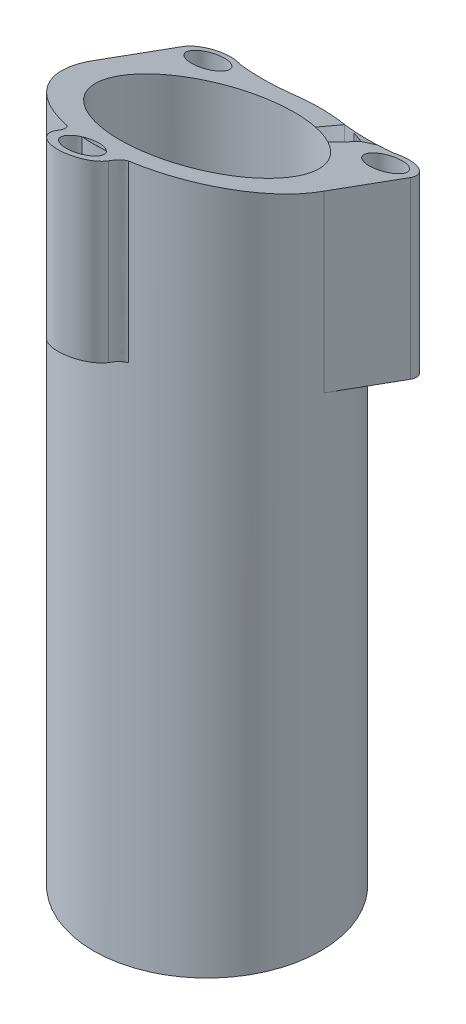
ISO-10303-21;
HEADER;
FILE_DESCRIPTION(('STEP AP214'),'2;1');
FILE_NAME('part.step','',(''),(''),'','','');
FILE_SCHEMA(('AUTOMOTIVE_DESIGN { 1 0 10303 214 1 1 1 1 }'));
ENDSEC;
DATA;
#1=APPLICATION_CONTEXT('core data for automotive mechanical design processes');
#2=APPLICATION_PROTOCOL_DEFINITION('international standard','automotive_design',2000,#1);
#3=PRODUCT_CONTEXT('',#1,'mechanical');
#4=PRODUCT('Part','Part','',(#3));
#5=PRODUCT_RELATED_PRODUCT_CATEGORY('part','',(#4));
#6=PRODUCT_DEFINITION_FORMATION('','',#4);
#7=PRODUCT_DEFINITION_CONTEXT('part definition',#1,'design');
#8=PRODUCT_DEFINITION('design','',#6,#7);
#9=PRODUCT_DEFINITION_SHAPE('','',#8);
#10=(LENGTH_UNIT() NAMED_UNIT(*) SI_UNIT(.MILLI.,.METRE.));
#11=(NAMED_UNIT(*) PLANE_ANGLE_UNIT() SI_UNIT($,.RADIAN.));
#12=(NAMED_UNIT(*) SI_UNIT($,.STERADIAN.) SOLID_ANGLE_UNIT());
#13=UNCERTAINTY_MEASURE_WITH_UNIT(LENGTH_MEASURE(1.E-05),#10,'distance_accuracy_value','');
#14=(GEOMETRIC_REPRESENTATION_CONTEXT(3) GLOBAL_UNCERTAINTY_ASSIGNED_CONTEXT((#13)) GLOBAL_UNIT_ASSIGNED_CONTEXT((#10,
#11,#12)) REPRESENTATION_CONTEXT('',''));
#15=CARTESIAN_POINT('',(0.,0.,0.));
#16=DIRECTION('',(0.,0.,1.));
#17=DIRECTION('',(1.,0.,0.));
#18=AXIS2_PLACEMENT_3D('',#15,#16,#17);
#19=CARTESIAN_POINT('',(0.,-40.,0.));
#20=DIRECTION('',(0.,1.,0.));
#21=DIRECTION('',(0.,0.,1.));
#22=AXIS2_PLACEMENT_3D('',#19,#20,#21);
#23=CYLINDRICAL_SURFACE('',#22,6.5);
#24=CARTESIAN_POINT('',(0.,-40.,0.));
#25=DIRECTION('',(0.,1.,0.));
#26=DIRECTION('',(0.,0.,1.));
#27=AXIS2_PLACEMENT_3D('',#24,#25,#26);
#28=CIRCLE('',#27,6.5);
#29=CARTESIAN_POINT('',(0.,-40.,6.5));
#30=VERTEX_POINT('',#29);
#31=EDGE_CURVE('E11',#30,#30,#28,.T.);
#32=ORIENTED_EDGE('',*,*,#31,.T.);
#33=EDGE_LOOP('',(#32));
#34=FACE_BOUND('',#33,.T.);
#35=CARTESIAN_POINT('',(0.,-12.3658065227303,0.));
#36=DIRECTION('',(0.,0.93969262078591,-0.342020143325666));
#37=DIRECTION('',(0.,0.342020143325666,0.93969262078591));
#38=AXIS2_PLACEMENT_3D('',#35,#36,#37);
#39=ELLIPSE('',#38,6.91715552109342,6.5);
#40=CARTESIAN_POINT('',(-4.96037224818147,-13.894685453274,-4.2005603387488));
#41=VERTEX_POINT('',#40);
#42=CARTESIAN_POINT('',(-6.4975,-12.4314158803476,-0.180260228558586));
#43=VERTEX_POINT('',#42);
#44=EDGE_CURVE('E311',#41,#43,#39,.T.);
#45=ORIENTED_EDGE('',*,*,#44,.F.);
#46=CARTESIAN_POINT('',(0.,-12.3658065227303,0.));
#47=DIRECTION('',(0.,0.93969262078591,-0.342020143325666));
#48=DIRECTION('',(0.,0.342020143325666,0.93969262078591));
#49=AXIS2_PLACEMENT_3D('',#46,#47,#48);
#50=ELLIPSE('',#49,6.91715552109342,6.5);
#51=CARTESIAN_POINT('',(-4.08862049074954,-14.2049615675026,-5.05303695638805));
#52=VERTEX_POINT('',#51);
#53=EDGE_CURVE('E231',#41,#52,#50,.F.);
#54=ORIENTED_EDGE('',*,*,#53,.T.);
#55=CARTESIAN_POINT('',(-3.08804748337541,-14.4475750839592,-5.71961211450705));
#56=VERTEX_POINT('',#55);
#57=EDGE_CURVE('E325',#56,#52,#39,.T.);
#58=ORIENTED_EDGE('',*,*,#57,.F.);
#59=DIRECTION('',(0.,1.,0.));
#60=VECTOR('',#59,1.);
#61=CARTESIAN_POINT('',(-3.08804748337541,-14.4475750839592,-5.71961211450705));
#62=LINE('',#61,#60);
#63=CARTESIAN_POINT('',(-3.08804748337541,-4.44757508395921,-5.71961211450705));
#64=VERTEX_POINT('',#63);
#65=EDGE_CURVE('E326',#56,#64,#62,.T.);
#66=ORIENTED_EDGE('',*,*,#65,.T.);
#67=CARTESIAN_POINT('',(0.,-2.36580652273029,0.));
#68=DIRECTION('',(0.,-0.93969262078591,0.342020143325666));
#69=DIRECTION('',(0.,0.342020143325666,0.93969262078591));
#70=AXIS2_PLACEMENT_3D('',#67,#68,#69);
#71=ELLIPSE('',#70,6.91715552109342,6.5);
#72=CARTESIAN_POINT('',(-2.32808527891433,-4.5746596493359,-6.06877408824052));
#73=VERTEX_POINT('',#72);
#74=EDGE_CURVE('E397',#73,#64,#71,.F.);
#75=ORIENTED_EDGE('',*,*,#74,.F.);
#76=DIRECTION('',(0.,1.,0.));
#77=VECTOR('',#76,1.);
#78=CARTESIAN_POINT('',(-2.32808527887807,-14.5746596493409,-6.06877408825442));
#79=LINE('',#78,#77);
#80=CARTESIAN_POINT('',(-2.32808527887807,-14.5746596493409,-6.06877408825442));
#81=VERTEX_POINT('',#80);
#82=EDGE_CURVE('E356',#81,#73,#79,.T.);
#83=ORIENTED_EDGE('',*,*,#82,.F.);
#84=CARTESIAN_POINT('',(0.,-12.3658065227303,0.));
#85=DIRECTION('',(0.,0.93969262078591,-0.342020143325666));
#86=DIRECTION('',(0.,0.342020143325666,0.93969262078591));
#87=AXIS2_PLACEMENT_3D('',#84,#85,#86);
#88=ELLIPSE('',#87,6.91715552109342,6.5);
#89=CARTESIAN_POINT('',(-1.5683771205031,-14.6617114081199,-6.30794682982366));
#90=VERTEX_POINT('',#89);
#91=EDGE_CURVE('E337',#90,#81,#88,.T.);
#92=ORIENTED_EDGE('',*,*,#91,.F.);
#93=DIRECTION('',(0.,1.,0.));
#94=VECTOR('',#93,1.);
#95=CARTESIAN_POINT('',(-1.5683771205031,-14.6617114081199,-6.30794682982366));
#96=LINE('',#95,#94);
#97=CARTESIAN_POINT('',(-1.5683771205031,-4.66171140811993,-6.30794682982366));
#98=VERTEX_POINT('',#97);
#99=EDGE_CURVE('E353',#90,#98,#96,.T.);
#100=ORIENTED_EDGE('',*,*,#99,.T.);
#101=CARTESIAN_POINT('',(1.56837711572616,-4.66171140844595,-6.30794683071938));
#102=VERTEX_POINT('',#101);
#103=EDGE_CURVE('E401',#102,#98,#71,.F.);
#104=ORIENTED_EDGE('',*,*,#103,.F.);
#105=DIRECTION('',(0.,1.,0.));
#106=VECTOR('',#105,1.);
#107=CARTESIAN_POINT('',(1.5683771205031,-14.6617114081199,-6.30794682982367));
#108=LINE('',#107,#106);
#109=CARTESIAN_POINT('',(1.5683771205031,-14.6617114081199,-6.30794682982367));
#110=VERTEX_POINT('',#109);
#111=EDGE_CURVE('E499',#110,#102,#108,.T.);
#112=ORIENTED_EDGE('',*,*,#111,.F.);
#113=CARTESIAN_POINT('',(0.,-12.3658065227303,0.));
#114=DIRECTION('',(0.,0.93969262078591,-0.342020143325666));
#115=DIRECTION('',(0.,0.342020143325666,0.93969262078591));
#116=AXIS2_PLACEMENT_3D('',#113,#114,#115);
#117=ELLIPSE('',#116,6.91715552109342,6.5);
#118=CARTESIAN_POINT('',(2.32808527887808,-14.5746596493409,-6.06877408825441));
#119=VERTEX_POINT('',#118);
#120=EDGE_CURVE('E623',#119,#110,#117,.T.);
#121=ORIENTED_EDGE('',*,*,#120,.F.);
#122=DIRECTION('',(0.,1.,0.));
#123=VECTOR('',#122,1.);
#124=CARTESIAN_POINT('',(2.32808527887808,-14.5746596493409,-6.06877408825441));
#125=LINE('',#124,#123);
#126=CARTESIAN_POINT('',(2.32808527887808,-4.57465964934088,-6.06877408825441));
#127=VERTEX_POINT('',#126);
#128=EDGE_CURVE('E496',#119,#127,#125,.T.);
#129=ORIENTED_EDGE('',*,*,#128,.T.);
#130=CARTESIAN_POINT('',(3.0880474833489,-4.4475750839645,-5.71961211452138));
#131=VERTEX_POINT('',#130);
#132=EDGE_CURVE('E394',#131,#127,#71,.F.);
#133=ORIENTED_EDGE('',*,*,#132,.F.);
#134=DIRECTION('',(0.,1.,0.));
#135=VECTOR('',#134,1.);
#136=CARTESIAN_POINT('',(3.0880474833754,-14.4475750839592,-5.71961211450706));
#137=LINE('',#136,#135);
#138=CARTESIAN_POINT('',(3.0880474833754,-14.4475750839592,-5.71961211450706));
#139=VERTEX_POINT('',#138);
#140=EDGE_CURVE('E494',#139,#131,#137,.T.);
#141=ORIENTED_EDGE('',*,*,#140,.F.);
#142=CARTESIAN_POINT('',(0.,-12.3658065227303,0.));
#143=DIRECTION('',(0.,0.93969262078591,-0.342020143325666));
#144=DIRECTION('',(0.,0.342020143325666,0.93969262078591));
#145=AXIS2_PLACEMENT_3D('',#142,#143,#144);
#146=ELLIPSE('',#145,6.91715552109342,6.5);
#147=CARTESIAN_POINT('',(4.08862049074956,-14.2049615675026,-5.05303695638804));
#148=VERTEX_POINT('',#147);
#149=EDGE_CURVE('E514',#148,#139,#146,.T.);
#150=ORIENTED_EDGE('',*,*,#149,.F.);
#151=CARTESIAN_POINT('',(0.,-12.3658065227303,0.));
#152=DIRECTION('',(0.,0.93969262078591,-0.342020143325666));
#153=DIRECTION('',(0.,0.342020143325666,0.93969262078591));
#154=AXIS2_PLACEMENT_3D('',#151,#152,#153);
#155=ELLIPSE('',#154,6.91715552109342,6.5);
#156=CARTESIAN_POINT('',(4.96037224818149,-13.8946854532741,-4.20056033874904));
#157=VERTEX_POINT('',#156);
#158=EDGE_CURVE('E284',#148,#157,#155,.F.);
#159=ORIENTED_EDGE('',*,*,#158,.T.);
#160=CARTESIAN_POINT('',(6.4975,-12.4314158803476,-0.180260228558586));
#161=VERTEX_POINT('',#160);
#162=EDGE_CURVE('E507',#161,#157,#146,.T.);
#163=ORIENTED_EDGE('',*,*,#162,.F.);
#164=DIRECTION('',(0.,1.,0.));
#165=VECTOR('',#164,1.);
#166=CARTESIAN_POINT('',(6.4975,-12.4314158803476,-0.180260228558586));
#167=LINE('',#166,#165);
#168=CARTESIAN_POINT('',(6.4975,-2.43141588034764,-0.180260228558586));
#169=VERTEX_POINT('',#168);
#170=EDGE_CURVE('E491',#161,#169,#167,.T.);
#171=ORIENTED_EDGE('',*,*,#170,.T.);
#172=CARTESIAN_POINT('',(1.75501972361136,-0.0878673051317265,6.25858656324225));
#173=VERTEX_POINT('',#172);
#174=EDGE_CURVE('E391',#173,#169,#71,.F.);
#175=ORIENTED_EDGE('',*,*,#174,.F.);
#176=DIRECTION('',(0.,1.,0.));
#177=VECTOR('',#176,1.);
#178=CARTESIAN_POINT('',(1.75501972358968,-10.0878673051255,6.25858656325941));
#179=LINE('',#178,#177);
#180=CARTESIAN_POINT('',(1.75501972358968,-10.0878673051255,6.25858656325941));
#181=VERTEX_POINT('',#180);
#182=EDGE_CURVE('E404',#181,#173,#179,.T.);
#183=ORIENTED_EDGE('',*,*,#182,.F.);
#184=CARTESIAN_POINT('',(0.,-12.3658065227303,0.));
#185=DIRECTION('',(0.,0.93969262078591,-0.342020143325666));
#186=DIRECTION('',(0.,0.342020143325666,0.93969262078591));
#187=AXIS2_PLACEMENT_3D('',#184,#185,#186);
#188=ELLIPSE('',#187,6.91715552109342,6.5);
#189=CARTESIAN_POINT('',(0.701745494266285,-10.0138277918496,6.46200845413227));
#190=VERTEX_POINT('',#189);
#191=EDGE_CURVE('E467',#190,#181,#188,.T.);
#192=ORIENTED_EDGE('',*,*,#191,.F.);
#193=DIRECTION('',(0.,1.,0.));
#194=VECTOR('',#193,1.);
#195=CARTESIAN_POINT('',(0.701745494266285,-10.0138277918496,6.46200845413227));
#196=LINE('',#195,#194);
#197=CARTESIAN_POINT('',(0.701745494266285,-0.0138277918496133,6.46200845413227));
#198=VERTEX_POINT('',#197);
#199=EDGE_CURVE('E408',#190,#198,#196,.T.);
#200=ORIENTED_EDGE('',*,*,#199,.T.);
#201=CARTESIAN_POINT('',(-0.701745494266283,-0.0138277918496132,6.46200845413227));
#202=VERTEX_POINT('',#201);
#203=EDGE_CURVE('E396',#202,#198,#71,.F.);
#204=ORIENTED_EDGE('',*,*,#203,.F.);
#205=DIRECTION('',(0.,1.,0.));
#206=VECTOR('',#205,1.);
#207=CARTESIAN_POINT('',(-0.701745494266283,-10.0138277918496,6.46200845413227));
#208=LINE('',#207,#206);
#209=CARTESIAN_POINT('',(-0.701745494266283,-10.0138277918496,6.46200845413227));
#210=VERTEX_POINT('',#209);
#211=EDGE_CURVE('E411',#210,#202,#208,.T.);
#212=ORIENTED_EDGE('',*,*,#211,.F.);
#213=CARTESIAN_POINT('',(-1.75501972358968,-10.0878673051255,6.25858656325941));
#214=VERTEX_POINT('',#213);
#215=EDGE_CURVE('E441',#214,#210,#188,.T.);
#216=ORIENTED_EDGE('',*,*,#215,.F.);
#217=DIRECTION('',(0.,1.,0.));
#218=VECTOR('',#217,1.);
#219=CARTESIAN_POINT('',(-1.75501972358968,-10.0878673051255,6.25858656325941));
#220=LINE('',#219,#218);
#221=CARTESIAN_POINT('',(-1.75501972358968,-0.0878673051254807,6.25858656325941));
#222=VERTEX_POINT('',#221);
#223=EDGE_CURVE('E414',#214,#222,#220,.T.);
#224=ORIENTED_EDGE('',*,*,#223,.T.);
#225=CARTESIAN_POINT('',(-6.4975,-2.43141588034764,-0.180260228558583));
#226=VERTEX_POINT('',#225);
#227=EDGE_CURVE('E400',#226,#222,#71,.F.);
#228=ORIENTED_EDGE('',*,*,#227,.F.);
#229=DIRECTION('',(0.,1.,0.));
#230=VECTOR('',#229,1.);
#231=CARTESIAN_POINT('',(-6.4975,-12.4314158803476,-0.180260228558586));
#232=LINE('',#231,#230);
#233=EDGE_CURVE('E317',#43,#226,#232,.T.);
#234=ORIENTED_EDGE('',*,*,#233,.F.);
#235=EDGE_LOOP('',(#45,#54,#58,#66,#75,#83,#92,#100,#104,#112,#121,#129,#133,#141,#150,#159,
#163,#171,#175,#183,#192,#200,#204,#212,#216,#224,#228,#234));
#236=FACE_BOUND('',#235,.T.);
#237=ADVANCED_FACE('F40',(#34,#236),#23,.T.);
#238=CARTESIAN_POINT('',(-6.5,0.,6.5));
#239=DIRECTION('',(0.,-0.93969262078591,0.342020143325666));
#240=DIRECTION('',(0.,-0.342020143325666,-0.93969262078591));
#241=AXIS2_PLACEMENT_3D('',#238,#239,#240);
#242=PLANE('',#241);
#243=CARTESIAN_POINT('',(-0.208497538331129,-2.29438972371368,0.196216042667867));
#244=DIRECTION('',(0.,0.93969262078591,-0.342020143325666));
#245=DIRECTION('',(0.,0.342020143325666,0.93969262078591));
#246=AXIS2_PLACEMENT_3D('',#243,#244,#245);
#247=CIRCLE('',#246,6.70923797517969);
#248=CARTESIAN_POINT('',(0.,-0.000803484512108127,6.4977924444461));
#249=VERTEX_POINT('',#248);
#250=CARTESIAN_POINT('',(0.68283017510881,-0.020035256572112,6.44495358497515));
#251=VERTEX_POINT('',#250);
#252=EDGE_CURVE('E210',#249,#251,#247,.T.);
#253=ORIENTED_EDGE('',*,*,#252,.F.);
#254=CARTESIAN_POINT('',(0.208497538331128,-2.29438972371368,0.196216042667868));
#255=DIRECTION('',(0.,0.93969262078591,-0.342020143325666));
#256=DIRECTION('',(0.,0.342020143325666,0.93969262078591));
#257=AXIS2_PLACEMENT_3D('',#254,#255,#256);
#258=CIRCLE('',#257,6.70923797517969);
#259=CARTESIAN_POINT('',(-0.682830175108809,-0.0200352565721116,6.44495358497515));
#260=VERTEX_POINT('',#259);
#261=EDGE_CURVE('E55',#260,#249,#258,.T.);
#262=ORIENTED_EDGE('',*,*,#261,.F.);
#263=CARTESIAN_POINT('',(0.,0.229836840266775,7.13147152879177));
#264=DIRECTION('',(0.,0.93969262078591,-0.342020143325666));
#265=DIRECTION('',(0.,0.342020143325666,0.93969262078591));
#266=AXIS2_PLACEMENT_3D('',#263,#264,#265);
#267=CIRCLE('',#266,1.);
#268=EDGE_CURVE('E201',#251,#260,#267,.T.);
#269=ORIENTED_EDGE('',*,*,#268,.F.);
#270=EDGE_LOOP('',(#253,#262,#269));
#271=FACE_BOUND('',#270,.T.);
#272=CARTESIAN_POINT('',(0.,-2.36580652273029,0.));
#273=DIRECTION('',(0.,-0.93969262078591,0.342020143325666));
#274=DIRECTION('',(0.,0.342020143325666,0.93969262078591));
#275=AXIS2_PLACEMENT_3D('',#272,#273,#274);
#276=ELLIPSE('',#275,5.32088886237955,5.);
#277=CARTESIAN_POINT('',(0.,-0.545955351399302,5.));
#278=VERTEX_POINT('',#277);
#279=EDGE_CURVE('E43',#278,#278,#276,.F.);
#280=ORIENTED_EDGE('',*,*,#279,.F.);
#281=EDGE_LOOP('',(#280));
#282=FACE_BOUND('',#281,.T.);
#283=ORIENTED_EDGE('',*,*,#74,.T.);
#284=CARTESIAN_POINT('',(0.,-2.61676021931636,-0.689489614698892));
#285=DIRECTION('',(0.,0.93969262078591,-0.342020143325666));
#286=DIRECTION('',(0.,0.342020143325666,0.93969262078591));
#287=AXIS2_PLACEMENT_3D('',#284,#285,#286);
#288=CIRCLE('',#287,6.17981008537088);
#289=EDGE_CURVE('E490',#64,#73,#288,.F.);
#290=ORIENTED_EDGE('',*,*,#289,.T.);
#291=EDGE_LOOP('',(#283,#290));
#292=FACE_BOUND('',#291,.T.);
#293=CARTESIAN_POINT('',(0.,0.229836840266775,7.13147152879177));
#294=DIRECTION('',(0.,0.93969262078591,-0.342020143325666));
#295=DIRECTION('',(0.,0.342020143325666,0.93969262078591));
#296=AXIS2_PLACEMENT_3D('',#293,#294,#295);
#297=CIRCLE('',#296,1.);
#298=EDGE_CURVE('E423',#202,#198,#297,.T.);
#299=ORIENTED_EDGE('',*,*,#298,.F.);
#300=ORIENTED_EDGE('',*,*,#203,.T.);
#301=EDGE_LOOP('',(#299,#300));
#302=FACE_BOUND('',#301,.T.);
#303=DIRECTION('',(0.,0.342020143325666,0.93969262078591));
#304=VECTOR('',#303,1.);
#305=CARTESIAN_POINT('',(-6.4975,-2.08905973148124,0.760355559863307));
#306=LINE('',#305,#304);
#307=CARTESIAN_POINT('',(-6.4975,-4.23403906034815,-5.13292671139553));
#308=VERTEX_POINT('',#307);
#309=EDGE_CURVE('E339',#308,#226,#306,.T.);
#310=ORIENTED_EDGE('',*,*,#309,.T.);
#311=ORIENTED_EDGE('',*,*,#227,.T.);
#312=CARTESIAN_POINT('',(-1.5,0.229836840266777,7.13147152879177));
#313=CARTESIAN_POINT('',(-1.44418798568542,-0.215169722947665,5.90882604485097));
#314=CARTESIAN_POINT('',(-2.50773942506667,-0.112183303058889,6.19177890800586));
#315=B_SPLINE_CURVE_WITH_KNOTS('',2,(#312,#313,#314),.UNSPECIFIED.,.F.,.F.,(3,3),(0.,1.),.UNSPECIFIED.);
#316=CARTESIAN_POINT('',(-1.5,0.229836840266775,7.13147152879177));
#317=VERTEX_POINT('',#316);
#318=EDGE_CURVE('E366',#317,#222,#315,.T.);
#319=ORIENTED_EDGE('',*,*,#318,.F.);
#320=CARTESIAN_POINT('',(0.,0.229836840266775,7.13147152879177));
#321=DIRECTION('',(0.,0.93969262078591,-0.342020143325666));
#322=DIRECTION('',(0.,0.342020143325666,0.93969262078591));
#323=AXIS2_PLACEMENT_3D('',#320,#321,#322);
#324=CIRCLE('',#323,1.5);
#325=CARTESIAN_POINT('',(1.5,0.229836840266775,7.13147152879177));
#326=VERTEX_POINT('',#325);
#327=EDGE_CURVE('E348',#317,#326,#324,.T.);
#328=ORIENTED_EDGE('',*,*,#327,.T.);
#329=CARTESIAN_POINT('',(1.5,0.229836840266777,7.13147152879177));
#330=CARTESIAN_POINT('',(1.44418798568541,-0.215169722947666,5.90882604485097));
#331=CARTESIAN_POINT('',(2.50773942506667,-0.112183303058889,6.19177890800586));
#332=B_SPLINE_CURVE_WITH_KNOTS('',2,(#329,#330,#331),.UNSPECIFIED.,.F.,.F.,(3,3),(0.,1.),.UNSPECIFIED.);
#333=EDGE_CURVE('E428',#326,#173,#332,.T.);
#334=ORIENTED_EDGE('',*,*,#333,.T.);
#335=ORIENTED_EDGE('',*,*,#174,.T.);
#336=DIRECTION('',(0.,0.342020143325666,0.93969262078591));
#337=VECTOR('',#336,1.);
#338=CARTESIAN_POINT('',(6.4975,-2.08905973148124,0.760355559863307));
#339=LINE('',#338,#337);
#340=CARTESIAN_POINT('',(6.4975,-4.23403906034815,-5.13292671139553));
#341=VERTEX_POINT('',#340);
#342=EDGE_CURVE('E480',#341,#169,#339,.T.);
#343=ORIENTED_EDGE('',*,*,#342,.F.);
#344=CARTESIAN_POINT('',(5.085,-4.23403906034815,-5.13292671139553));
#345=DIRECTION('',(0.,0.93969262078591,-0.342020143325666));
#346=DIRECTION('',(0.,0.342020143325666,0.93969262078591));
#347=AXIS2_PLACEMENT_3D('',#344,#345,#346);
#348=CIRCLE('',#347,1.4125);
#349=CARTESIAN_POINT('',(4.40955085002037,-4.65832668932283,-6.29864739135743));
#350=VERTEX_POINT('',#349);
#351=EDGE_CURVE('E229',#350,#341,#348,.F.);
#352=ORIENTED_EDGE('',*,*,#351,.F.);
#353=CARTESIAN_POINT('',(1.54182835744469,-4.6635391253547,-6.31296844165534));
#354=CARTESIAN_POINT('',(3.01133367562147,-4.56149656565935,-6.03260881306901));
#355=CARTESIAN_POINT('',(4.40955085002037,-4.65832668932283,-6.29864739135743));
#356=B_SPLINE_CURVE_WITH_KNOTS('',2,(#353,#354,#355),.UNSPECIFIED.,.F.,.F.,(3,3),(0.,
0.804475913715981),.UNSPECIFIED.);
#357=EDGE_CURVE('E63',#102,#350,#356,.T.);
#358=ORIENTED_EDGE('',*,*,#357,.F.);
#359=ORIENTED_EDGE('',*,*,#103,.T.);
#360=CARTESIAN_POINT('',(-1.54182835744469,-4.6635391253547,-6.31296844165534));
#361=CARTESIAN_POINT('',(-3.01133367562147,-4.56149656565935,-6.03260881306901));
#362=CARTESIAN_POINT('',(-4.40955085002037,-4.65832668932283,-6.29864739135743));
#363=B_SPLINE_CURVE_WITH_KNOTS('',2,(#360,#361,#362),.UNSPECIFIED.,.F.,.F.,(3,3),(0.,
0.804475913715981),.UNSPECIFIED.);
#364=CARTESIAN_POINT('',(-4.40955085002037,-4.65832668932283,-6.29864739135743));
#365=VERTEX_POINT('',#364);
#366=EDGE_CURVE('E569',#98,#365,#363,.T.);
#367=ORIENTED_EDGE('',*,*,#366,.T.);
#368=CARTESIAN_POINT('',(-5.085,-4.23403906034815,-5.13292671139553));
#369=DIRECTION('',(0.,0.93969262078591,-0.342020143325666));
#370=DIRECTION('',(0.,0.342020143325666,0.93969262078591));
#371=AXIS2_PLACEMENT_3D('',#368,#369,#370);
#372=CIRCLE('',#371,1.4125);
#373=EDGE_CURVE('E343',#365,#308,#372,.T.);
#374=ORIENTED_EDGE('',*,*,#373,.T.);
#375=EDGE_LOOP('',(#310,#311,#319,#328,#334,#335,#343,#352,#358,#359,#367,#374));
#376=FACE_BOUND('',#375,.T.);
#377=CARTESIAN_POINT('',(-5.085,-4.23403906034815,-5.13292671139553));
#378=DIRECTION('',(0.,0.93969262078591,-0.342020143325666));
#379=DIRECTION('',(0.,0.342020143325666,0.93969262078591));
#380=AXIS2_PLACEMENT_3D('',#377,#378,#379);
#381=CIRCLE('',#380,1.);
#382=CARTESIAN_POINT('',(-5.085,-3.89201891702248,-4.19323409060962));
#383=VERTEX_POINT('',#382);
#384=EDGE_CURVE('E334',#383,#383,#381,.T.);
#385=ORIENTED_EDGE('',*,*,#384,.F.);
#386=EDGE_LOOP('',(#385));
#387=FACE_BOUND('',#386,.T.);
#388=CARTESIAN_POINT('',(0.,-2.61676021931636,-0.689489614698892));
#389=DIRECTION('',(0.,0.93969262078591,-0.342020143325666));
#390=DIRECTION('',(0.,0.342020143325666,0.93969262078591));
#391=AXIS2_PLACEMENT_3D('',#388,#389,#390);
#392=CIRCLE('',#391,6.17981008537088);
#393=EDGE_CURVE('E474',#127,#131,#392,.F.);
#394=ORIENTED_EDGE('',*,*,#393,.T.);
#395=ORIENTED_EDGE('',*,*,#132,.T.);
#396=EDGE_LOOP('',(#394,#395));
#397=FACE_BOUND('',#396,.T.);
#398=CARTESIAN_POINT('',(5.085,-4.23403906034815,-5.13292671139553));
#399=DIRECTION('',(0.,0.93969262078591,-0.342020143325666));
#400=DIRECTION('',(0.,0.342020143325666,0.93969262078591));
#401=AXIS2_PLACEMENT_3D('',#398,#399,#400);
#402=CIRCLE('',#401,1.);
#403=CARTESIAN_POINT('',(5.085,-3.89201891702248,-4.19323409060962));
#404=VERTEX_POINT('',#403);
#405=EDGE_CURVE('E478',#404,#404,#402,.F.);
#406=ORIENTED_EDGE('',*,*,#405,.T.);
#407=EDGE_LOOP('',(#406));
#408=FACE_BOUND('',#407,.T.);
#409=ADVANCED_FACE('F214',(#271,#282,#292,#302,#376,#387,#397,#408),#242,.F.);
#410=CARTESIAN_POINT('',(0.,-40.,0.));
#411=DIRECTION('',(0.,1.,0.));
#412=DIRECTION('',(0.,0.,1.));
#413=AXIS2_PLACEMENT_3D('',#410,#411,#412);
#414=PLANE('',#413);
#415=CARTESIAN_POINT('',(0.,-40.,0.));
#416=DIRECTION('',(0.,1.,0.));
#417=DIRECTION('',(0.,0.,1.));
#418=AXIS2_PLACEMENT_3D('',#415,#416,#417);
#419=CIRCLE('',#418,5.);
#420=CARTESIAN_POINT('',(0.,-40.,5.));
#421=VERTEX_POINT('',#420);
#422=EDGE_CURVE('E48',#421,#421,#419,.T.);
#423=ORIENTED_EDGE('',*,*,#422,.T.);
#424=EDGE_LOOP('',(#423));
#425=FACE_BOUND('',#424,.T.);
#426=ORIENTED_EDGE('',*,*,#31,.F.);
#427=EDGE_LOOP('',(#426));
#428=FACE_BOUND('',#427,.T.);
#429=ADVANCED_FACE('F304',(#425,#428),#414,.F.);
#430=CARTESIAN_POINT('',(0.,-40.,0.));
#431=DIRECTION('',(0.,1.,0.));
#432=DIRECTION('',(0.,0.,1.));
#433=AXIS2_PLACEMENT_3D('',#430,#431,#432);
#434=CYLINDRICAL_SURFACE('',#433,5.);
#435=ORIENTED_EDGE('',*,*,#279,.T.);
#436=EDGE_LOOP('',(#435));
#437=FACE_BOUND('',#436,.T.);
#438=ORIENTED_EDGE('',*,*,#422,.F.);
#439=EDGE_LOOP('',(#438));
#440=FACE_BOUND('',#439,.T.);
#441=ADVANCED_FACE('F376',(#437,#440),#434,.F.);
#442=CARTESIAN_POINT('',(0.,-9.77016315973323,7.13147152879177));
#443=DIRECTION('',(0.,0.93969262078591,-0.342020143325666));
#444=DIRECTION('',(0.,0.342020143325666,0.93969262078591));
#445=AXIS2_PLACEMENT_3D('',#442,#443,#444);
#446=CIRCLE('',#445,1.5);
#447=DIRECTION('',(0.,1.,0.));
#448=VECTOR('',#447,1.);
#449=SURFACE_OF_LINEAR_EXTRUSION('',#446,#448);
#450=ORIENTED_EDGE('',*,*,#327,.F.);
#451=DIRECTION('',(0.,1.,0.));
#452=VECTOR('',#451,1.);
#453=CARTESIAN_POINT('',(-1.5,-9.77016315973323,7.13147152879177));
#454=LINE('',#453,#452);
#455=CARTESIAN_POINT('',(-1.5,-9.77016315973323,7.13147152879177));
#456=VERTEX_POINT('',#455);
#457=EDGE_CURVE('E417',#456,#317,#454,.T.);
#458=ORIENTED_EDGE('',*,*,#457,.F.);
#459=CARTESIAN_POINT('',(1.5,-9.77016315973323,7.13147152879177));
#460=VERTEX_POINT('',#459);
#461=EDGE_CURVE('E361',#456,#460,#446,.T.);
#462=ORIENTED_EDGE('',*,*,#461,.T.);
#463=DIRECTION('',(0.,1.,0.));
#464=VECTOR('',#463,1.);
#465=CARTESIAN_POINT('',(1.5,-9.77016315973323,7.13147152879177));
#466=LINE('',#465,#464);
#467=EDGE_CURVE('E402',#460,#326,#466,.T.);
#468=ORIENTED_EDGE('',*,*,#467,.T.);
#469=EDGE_LOOP('',(#450,#458,#462,#468));
#470=FACE_BOUND('',#469,.T.);
#471=ADVANCED_FACE('F372',(#470),#449,.T.);
#472=CARTESIAN_POINT('',(-1.5,-9.77016315973322,7.13147152879177));
#473=CARTESIAN_POINT('',(-1.44418798568542,-10.2151697229477,5.90882604485097));
#474=CARTESIAN_POINT('',(-2.50773942506667,-10.1121833030589,6.19177890800586));
#475=B_SPLINE_CURVE_WITH_KNOTS('',2,(#472,#473,#474),.UNSPECIFIED.,.F.,.F.,(3,3),(0.,1.),.UNSPECIFIED.);
#476=DIRECTION('',(0.,1.,0.));
#477=VECTOR('',#476,1.);
#478=SURFACE_OF_LINEAR_EXTRUSION('',#475,#477);
#479=ORIENTED_EDGE('',*,*,#318,.T.);
#480=ORIENTED_EDGE('',*,*,#223,.F.);
#481=EDGE_CURVE('E405',#456,#214,#475,.T.);
#482=ORIENTED_EDGE('',*,*,#481,.F.);
#483=ORIENTED_EDGE('',*,*,#457,.T.);
#484=EDGE_LOOP('',(#479,#480,#482,#483));
#485=FACE_BOUND('',#484,.T.);
#486=ADVANCED_FACE('F375',(#485),#478,.F.);
#487=CARTESIAN_POINT('',(0.,-9.77016315973323,7.13147152879177));
#488=DIRECTION('',(0.,0.93969262078591,-0.342020143325666));
#489=DIRECTION('',(0.,0.342020143325666,0.93969262078591));
#490=AXIS2_PLACEMENT_3D('',#487,#488,#489);
#491=CIRCLE('',#490,1.);
#492=DIRECTION('',(0.,1.,0.));
#493=VECTOR('',#492,1.);
#494=SURFACE_OF_LINEAR_EXTRUSION('',#491,#493);
#495=ORIENTED_EDGE('',*,*,#298,.T.);
#496=ORIENTED_EDGE('',*,*,#199,.F.);
#497=EDGE_CURVE('E442',#210,#190,#491,.T.);
#498=ORIENTED_EDGE('',*,*,#497,.F.);
#499=ORIENTED_EDGE('',*,*,#211,.T.);
#500=EDGE_LOOP('',(#495,#496,#498,#499));
#501=FACE_BOUND('',#500,.T.);
#502=ADVANCED_FACE('F450',(#501),#494,.F.);
#503=CARTESIAN_POINT('',(1.5,-9.77016315973322,7.13147152879177));
#504=CARTESIAN_POINT('',(1.44418798568541,-10.2151697229477,5.90882604485097));
#505=CARTESIAN_POINT('',(2.50773942506667,-10.1121833030589,6.19177890800586));
#506=B_SPLINE_CURVE_WITH_KNOTS('',2,(#503,#504,#505),.UNSPECIFIED.,.F.,.F.,(3,3),(0.,1.),.UNSPECIFIED.);
#507=DIRECTION('',(0.,1.,0.));
#508=VECTOR('',#507,1.);
#509=SURFACE_OF_LINEAR_EXTRUSION('',#506,#508);
#510=ORIENTED_EDGE('',*,*,#333,.F.);
#511=ORIENTED_EDGE('',*,*,#467,.F.);
#512=EDGE_CURVE('E365',#460,#181,#506,.T.);
#513=ORIENTED_EDGE('',*,*,#512,.T.);
#514=ORIENTED_EDGE('',*,*,#182,.T.);
#515=EDGE_LOOP('',(#510,#511,#513,#514));
#516=FACE_BOUND('',#515,.T.);
#517=ADVANCED_FACE('F378',(#516),#509,.T.);
#518=CARTESIAN_POINT('',(0.,-12.0890597314812,0.760355559863308));
#519=DIRECTION('',(0.,0.93969262078591,-0.342020143325666));
#520=DIRECTION('',(0.,0.342020143325666,0.93969262078591));
#521=AXIS2_PLACEMENT_3D('',#518,#519,#520);
#522=PLANE('',#521);
#523=ORIENTED_EDGE('',*,*,#461,.F.);
#524=ORIENTED_EDGE('',*,*,#481,.T.);
#525=ORIENTED_EDGE('',*,*,#215,.T.);
#526=ORIENTED_EDGE('',*,*,#497,.T.);
#527=ORIENTED_EDGE('',*,*,#191,.T.);
#528=ORIENTED_EDGE('',*,*,#512,.F.);
#529=EDGE_LOOP('',(#523,#524,#525,#526,#527,#528));
#530=FACE_BOUND('',#529,.T.);
#531=ADVANCED_FACE('F452',(#530),#522,.F.);
#532=CARTESIAN_POINT('',(-5.085,-14.2340390603481,-5.13292671139553));
#533=DIRECTION('',(0.,0.93969262078591,-0.342020143325666));
#534=DIRECTION('',(0.,0.342020143325666,0.93969262078591));
#535=AXIS2_PLACEMENT_3D('',#532,#533,#534);
#536=CIRCLE('',#535,1.);
#537=DIRECTION('',(0.,1.,0.));
#538=VECTOR('',#537,1.);
#539=SURFACE_OF_LINEAR_EXTRUSION('',#536,#538);
#540=ORIENTED_EDGE('',*,*,#384,.T.);
#541=EDGE_LOOP('',(#540));
#542=FACE_BOUND('',#541,.T.);
#543=CARTESIAN_POINT('',(-4.0886204907493,-14.2049615675026,-5.05303695638803));
#544=CARTESIAN_POINT('',(-4.09328809746922,-14.1860707316522,-5.00113481145438));
#545=CARTESIAN_POINT('',(-4.10263373430791,-14.1673209287334,-4.94962015131572));
#546=CARTESIAN_POINT('',(-4.1302298170119,-14.1306035012097,-4.848739848294));
#547=CARTESIAN_POINT('',(-4.1484802628772,-14.1126358766049,-4.79937420541092));
#548=CARTESIAN_POINT('',(-4.19343471242347,-14.0779829181598,-4.70416598456592));
#549=CARTESIAN_POINT('',(-4.22013871610445,-14.0612975843197,-4.658323406604));
#550=CARTESIAN_POINT('',(-4.28124875095609,-14.0296682803048,-4.57142260803008));
#551=CARTESIAN_POINT('',(-4.31565478212676,-14.0147243101301,-4.53036438741807));
#552=CARTESIAN_POINT('',(-4.39122777656373,-13.9869898925483,-4.45416470137049));
#553=CARTESIAN_POINT('',(-4.43239473983002,-13.9741994451413,-4.41902323593492));
#554=CARTESIAN_POINT('',(-4.52033767664197,-13.9511260458381,-4.35562959235943));
#555=CARTESIAN_POINT('',(-4.56711365018761,-13.940843093942,-4.32737741421952));
#556=CARTESIAN_POINT('',(-4.6686478752267,-13.9224089663422,-4.27673006489174));
#557=CARTESIAN_POINT('',(-4.72374027404785,-13.9144705090261,-4.25491933267034));
#558=CARTESIAN_POINT('',(-4.80970114808021,-13.9050658662503,-4.22908028900581));
#559=CARTESIAN_POINT('',(-4.83942837235231,-13.9023250734029,-4.22155002254611));
#560=CARTESIAN_POINT('',(-4.8994963531972,-13.8977907626599,-4.209092106167));
#561=CARTESIAN_POINT('',(-4.92983715240887,-13.895997310834,-4.20416463777247));
#562=CARTESIAN_POINT('',(-4.96037224818147,-13.894685453274,-4.2005603387488));
#563=B_SPLINE_CURVE_WITH_KNOTS('',3,(#543,#544,#545,#546,#547,#548,#549,#550,#551,#552,#553,
#554,#555,#556,#557,#558,#559,#560,#561,#562),.UNSPECIFIED.,.F.,.F.,(4,2,2,2,2,2,2,2,2,4),(0.,
0.166076362379822,0.332152724759643,0.498229087139464,0.664305449519285,0.830381811899107,
0.996458174278928,1.17476310127632,1.26701471572629,1.35927276315789),.UNSPECIFIED.);
#564=EDGE_CURVE('E270',#52,#41,#563,.T.);
#565=ORIENTED_EDGE('',*,*,#564,.T.);
#566=EDGE_CURVE('E322',#52,#41,#536,.T.);
#567=ORIENTED_EDGE('',*,*,#566,.F.);
#568=EDGE_LOOP('',(#565,#567));
#569=FACE_BOUND('',#568,.T.);
#570=ADVANCED_FACE('F548',(#542,#569),#539,.F.);
#571=CARTESIAN_POINT('',(-6.4975,-12.0890597314812,0.760355559863307));
#572=DIRECTION('',(-1.,0.,0.));
#573=DIRECTION('',(0.,0.,1.));
#574=AXIS2_PLACEMENT_3D('',#571,#572,#573);
#575=PLANE('',#574);
#576=ORIENTED_EDGE('',*,*,#309,.F.);
#577=DIRECTION('',(0.,1.,0.));
#578=VECTOR('',#577,1.);
#579=CARTESIAN_POINT('',(-6.4975,-14.2340390603481,-5.13292671139553));
#580=LINE('',#579,#578);
#581=CARTESIAN_POINT('',(-6.4975,-14.2340390603481,-5.13292671139553));
#582=VERTEX_POINT('',#581);
#583=EDGE_CURVE('E349',#582,#308,#580,.T.);
#584=ORIENTED_EDGE('',*,*,#583,.F.);
#585=DIRECTION('',(0.,0.342020143325666,0.93969262078591));
#586=VECTOR('',#585,1.);
#587=CARTESIAN_POINT('',(-6.4975,-12.0890597314812,0.760355559863307));
#588=LINE('',#587,#586);
#589=EDGE_CURVE('E323',#582,#43,#588,.T.);
#590=ORIENTED_EDGE('',*,*,#589,.T.);
#591=ORIENTED_EDGE('',*,*,#233,.T.);
#592=EDGE_LOOP('',(#576,#584,#590,#591));
#593=FACE_BOUND('',#592,.T.);
#594=ADVANCED_FACE('F552',(#593),#575,.T.);
#595=CARTESIAN_POINT('',(-5.085,-14.2340390603481,-5.13292671139553));
#596=DIRECTION('',(0.,0.93969262078591,-0.342020143325666));
#597=DIRECTION('',(0.,0.342020143325666,0.93969262078591));
#598=AXIS2_PLACEMENT_3D('',#595,#596,#597);
#599=CIRCLE('',#598,1.4125);
#600=DIRECTION('',(0.,1.,0.));
#601=VECTOR('',#600,1.);
#602=SURFACE_OF_LINEAR_EXTRUSION('',#599,#601);
#603=ORIENTED_EDGE('',*,*,#373,.F.);
#604=DIRECTION('',(0.,1.,0.));
#605=VECTOR('',#604,1.);
#606=CARTESIAN_POINT('',(-4.40955085002037,-14.6583266893228,-6.29864739135743));
#607=LINE('',#606,#605);
#608=CARTESIAN_POINT('',(-4.40955085002037,-14.6583266893228,-6.29864739135743));
#609=VERTEX_POINT('',#608);
#610=EDGE_CURVE('E351',#609,#365,#607,.T.);
#611=ORIENTED_EDGE('',*,*,#610,.F.);
#612=EDGE_CURVE('E328',#609,#582,#599,.T.);
#613=ORIENTED_EDGE('',*,*,#612,.T.);
#614=ORIENTED_EDGE('',*,*,#583,.T.);
#615=EDGE_LOOP('',(#603,#611,#613,#614));
#616=FACE_BOUND('',#615,.T.);
#617=ADVANCED_FACE('F557',(#616),#602,.T.);
#618=CARTESIAN_POINT('',(-1.54182835744469,-14.6635391253547,-6.31296844165534));
#619=CARTESIAN_POINT('',(-3.01133367562147,-14.5614965656593,-6.03260881306901));
#620=CARTESIAN_POINT('',(-4.40955085002037,-14.6583266893228,-6.29864739135743));
#621=B_SPLINE_CURVE_WITH_KNOTS('',2,(#618,#619,#620),.UNSPECIFIED.,.F.,.F.,(3,3),(0.,
0.804475913715981),.UNSPECIFIED.);
#622=DIRECTION('',(0.,1.,0.));
#623=VECTOR('',#622,1.);
#624=SURFACE_OF_LINEAR_EXTRUSION('',#621,#623);
#625=ORIENTED_EDGE('',*,*,#366,.F.);
#626=ORIENTED_EDGE('',*,*,#99,.F.);
#627=EDGE_CURVE('E581',#90,#609,#621,.T.);
#628=ORIENTED_EDGE('',*,*,#627,.T.);
#629=ORIENTED_EDGE('',*,*,#610,.T.);
#630=EDGE_LOOP('',(#625,#626,#628,#629));
#631=FACE_BOUND('',#630,.T.);
#632=ADVANCED_FACE('F583',(#631),#624,.T.);
#633=CARTESIAN_POINT('',(0.,-12.6167602193164,-0.689489614698892));
#634=DIRECTION('',(0.,0.93969262078591,-0.342020143325666));
#635=DIRECTION('',(0.,0.342020143325666,0.93969262078591));
#636=AXIS2_PLACEMENT_3D('',#633,#634,#635);
#637=CIRCLE('',#636,6.17981008537088);
#638=DIRECTION('',(0.,1.,0.));
#639=VECTOR('',#638,1.);
#640=SURFACE_OF_LINEAR_EXTRUSION('',#637,#639);
#641=ORIENTED_EDGE('',*,*,#289,.F.);
#642=ORIENTED_EDGE('',*,*,#65,.F.);
#643=EDGE_CURVE('E333',#56,#81,#637,.F.);
#644=ORIENTED_EDGE('',*,*,#643,.T.);
#645=ORIENTED_EDGE('',*,*,#82,.T.);
#646=EDGE_LOOP('',(#641,#642,#644,#645));
#647=FACE_BOUND('',#646,.T.);
#648=ADVANCED_FACE('F595',(#647),#640,.F.);
#649=CARTESIAN_POINT('',(0.,-12.0890597314812,0.760355559863308));
#650=DIRECTION('',(0.,0.93969262078591,-0.342020143325666));
#651=DIRECTION('',(0.,0.342020143325666,0.93969262078591));
#652=AXIS2_PLACEMENT_3D('',#649,#650,#651);
#653=PLANE('',#652);
#654=ORIENTED_EDGE('',*,*,#57,.T.);
#655=ORIENTED_EDGE('',*,*,#566,.T.);
#656=ORIENTED_EDGE('',*,*,#44,.T.);
#657=ORIENTED_EDGE('',*,*,#589,.F.);
#658=ORIENTED_EDGE('',*,*,#612,.F.);
#659=ORIENTED_EDGE('',*,*,#627,.F.);
#660=ORIENTED_EDGE('',*,*,#91,.T.);
#661=ORIENTED_EDGE('',*,*,#643,.F.);
#662=EDGE_LOOP('',(#654,#655,#656,#657,#658,#659,#660,#661));
#663=FACE_BOUND('',#662,.T.);
#664=ADVANCED_FACE('F562',(#663),#653,.F.);
#665=CARTESIAN_POINT('',(5.085,-14.2340390603481,-5.13292671139553));
#666=DIRECTION('',(0.,0.93969262078591,-0.342020143325666));
#667=DIRECTION('',(0.,0.342020143325666,0.93969262078591));
#668=AXIS2_PLACEMENT_3D('',#665,#666,#667);
#669=CIRCLE('',#668,1.4125);
#670=DIRECTION('',(0.,1.,0.));
#671=VECTOR('',#670,1.);
#672=SURFACE_OF_LINEAR_EXTRUSION('',#669,#671);
#673=ORIENTED_EDGE('',*,*,#351,.T.);
#674=DIRECTION('',(0.,1.,0.));
#675=VECTOR('',#674,1.);
#676=CARTESIAN_POINT('',(6.4975,-14.2340390603481,-5.13292671139553));
#677=LINE('',#676,#675);
#678=CARTESIAN_POINT('',(6.4975,-14.2340390603481,-5.13292671139553));
#679=VERTEX_POINT('',#678);
#680=EDGE_CURVE('E487',#679,#341,#677,.T.);
#681=ORIENTED_EDGE('',*,*,#680,.F.);
#682=CARTESIAN_POINT('',(4.40955085002037,-14.6583266893228,-6.29864739135743));
#683=VERTEX_POINT('',#682);
#684=EDGE_CURVE('E482',#683,#679,#669,.F.);
#685=ORIENTED_EDGE('',*,*,#684,.F.);
#686=DIRECTION('',(0.,1.,0.));
#687=VECTOR('',#686,1.);
#688=CARTESIAN_POINT('',(4.40955085002037,-14.6583266893228,-6.29864739135743));
#689=LINE('',#688,#687);
#690=EDGE_CURVE('E500',#683,#350,#689,.T.);
#691=ORIENTED_EDGE('',*,*,#690,.T.);
#692=EDGE_LOOP('',(#673,#681,#685,#691));
#693=FACE_BOUND('',#692,.T.);
#694=ADVANCED_FACE('F602',(#693),#672,.T.);
#695=CARTESIAN_POINT('',(6.4975,-12.0890597314812,0.760355559863307));
#696=DIRECTION('',(-1.,0.,0.));
#697=DIRECTION('',(0.,0.,1.));
#698=AXIS2_PLACEMENT_3D('',#695,#696,#697);
#699=PLANE('',#698);
#700=ORIENTED_EDGE('',*,*,#342,.T.);
#701=ORIENTED_EDGE('',*,*,#170,.F.);
#702=DIRECTION('',(0.,0.342020143325666,0.93969262078591));
#703=VECTOR('',#702,1.);
#704=CARTESIAN_POINT('',(6.4975,-12.0890597314812,0.760355559863307));
#705=LINE('',#704,#703);
#706=EDGE_CURVE('E502',#679,#161,#705,.T.);
#707=ORIENTED_EDGE('',*,*,#706,.F.);
#708=ORIENTED_EDGE('',*,*,#680,.T.);
#709=EDGE_LOOP('',(#700,#701,#707,#708));
#710=FACE_BOUND('',#709,.T.);
#711=ADVANCED_FACE('F607',(#710),#699,.F.);
#712=CARTESIAN_POINT('',(5.085,-14.2340390603481,-5.13292671139553));
#713=DIRECTION('',(0.,0.93969262078591,-0.342020143325666));
#714=DIRECTION('',(0.,0.342020143325666,0.93969262078591));
#715=AXIS2_PLACEMENT_3D('',#712,#713,#714);
#716=CIRCLE('',#715,1.);
#717=DIRECTION('',(0.,1.,0.));
#718=VECTOR('',#717,1.);
#719=SURFACE_OF_LINEAR_EXTRUSION('',#716,#718);
#720=ORIENTED_EDGE('',*,*,#405,.F.);
#721=EDGE_LOOP('',(#720));
#722=FACE_BOUND('',#721,.T.);
#723=CARTESIAN_POINT('',(4.0886204907493,-14.2049615675026,-5.05303695638802));
#724=CARTESIAN_POINT('',(4.09328809746923,-14.1860707316522,-5.00113481145436));
#725=CARTESIAN_POINT('',(4.10263373430792,-14.1673209287334,-4.94962015131571));
#726=CARTESIAN_POINT('',(4.13022981701191,-14.1306035012097,-4.84873984829398));
#727=CARTESIAN_POINT('',(4.14848026287721,-14.1126358766048,-4.7993742054109));
#728=CARTESIAN_POINT('',(4.19343471242348,-14.0779829181598,-4.70416598456591));
#729=CARTESIAN_POINT('',(4.22013871610446,-14.0612975843197,-4.65832340660399));
#730=CARTESIAN_POINT('',(4.2812487509561,-14.0296682803048,-4.57142260803006));
#731=CARTESIAN_POINT('',(4.31565478212677,-14.0147243101301,-4.53036438741806));
#732=CARTESIAN_POINT('',(4.39122777656374,-13.9869898925483,-4.45416470137048));
#733=CARTESIAN_POINT('',(4.43239473983004,-13.9741994451413,-4.41902323593491));
#734=CARTESIAN_POINT('',(4.52033767664198,-13.9511260458381,-4.35562959235942));
#735=CARTESIAN_POINT('',(4.56711365018762,-13.940843093942,-4.32737741421951));
#736=CARTESIAN_POINT('',(4.66864787522671,-13.9224089663422,-4.27673006489173));
#737=CARTESIAN_POINT('',(4.72374027404786,-13.9144705090261,-4.25491933267034));
#738=CARTESIAN_POINT('',(4.80970114808021,-13.9050658662503,-4.22908028900581));
#739=CARTESIAN_POINT('',(4.83942837235231,-13.9023250734029,-4.22155002254611));
#740=CARTESIAN_POINT('',(4.89949635319719,-13.8977907626599,-4.209092106167));
#741=CARTESIAN_POINT('',(4.92983715240886,-13.895997310834,-4.20416463777247));
#742=CARTESIAN_POINT('',(4.96037224818146,-13.894685453274,-4.2005603387488));
#743=B_SPLINE_CURVE_WITH_KNOTS('',3,(#723,#724,#725,#726,#727,#728,#729,#730,#731,#732,#733,
#734,#735,#736,#737,#738,#739,#740,#741,#742),.UNSPECIFIED.,.F.,.F.,(4,2,2,2,2,2,2,2,2,4),(0.,
0.166076362379821,0.332152724759644,0.498229087139467,0.664305449519287,0.830381811899108,
0.996458174278929,1.17476310127631,1.26701471572627,1.35927276315786),.UNSPECIFIED.);
#744=EDGE_CURVE('E277',#148,#157,#743,.T.);
#745=ORIENTED_EDGE('',*,*,#744,.F.);
#746=EDGE_CURVE('E512',#148,#157,#716,.F.);
#747=ORIENTED_EDGE('',*,*,#746,.T.);
#748=EDGE_LOOP('',(#745,#747));
#749=FACE_BOUND('',#748,.T.);
#750=ADVANCED_FACE('F611',(#722,#749),#719,.F.);
#751=CARTESIAN_POINT('',(0.,-12.6167602193164,-0.689489614698892));
#752=DIRECTION('',(0.,0.93969262078591,-0.342020143325666));
#753=DIRECTION('',(0.,0.342020143325666,0.93969262078591));
#754=AXIS2_PLACEMENT_3D('',#751,#752,#753);
#755=CIRCLE('',#754,6.17981008537088);
#756=DIRECTION('',(0.,1.,0.));
#757=VECTOR('',#756,1.);
#758=SURFACE_OF_LINEAR_EXTRUSION('',#755,#757);
#759=ORIENTED_EDGE('',*,*,#393,.F.);
#760=ORIENTED_EDGE('',*,*,#128,.F.);
#761=EDGE_CURVE('E628',#119,#139,#755,.F.);
#762=ORIENTED_EDGE('',*,*,#761,.T.);
#763=ORIENTED_EDGE('',*,*,#140,.T.);
#764=EDGE_LOOP('',(#759,#760,#762,#763));
#765=FACE_BOUND('',#764,.T.);
#766=ADVANCED_FACE('F631',(#765),#758,.F.);
#767=CARTESIAN_POINT('',(1.54182835744469,-14.6635391253547,-6.31296844165534));
#768=CARTESIAN_POINT('',(3.01133367562147,-14.5614965656593,-6.03260881306901));
#769=CARTESIAN_POINT('',(4.40955085002037,-14.6583266893228,-6.29864739135743));
#770=B_SPLINE_CURVE_WITH_KNOTS('',2,(#767,#768,#769),.UNSPECIFIED.,.F.,.F.,(3,3),(0.,
0.804475913715981),.UNSPECIFIED.);
#771=DIRECTION('',(0.,1.,0.));
#772=VECTOR('',#771,1.);
#773=SURFACE_OF_LINEAR_EXTRUSION('',#770,#772);
#774=ORIENTED_EDGE('',*,*,#357,.T.);
#775=ORIENTED_EDGE('',*,*,#690,.F.);
#776=EDGE_CURVE('E527',#110,#683,#770,.T.);
#777=ORIENTED_EDGE('',*,*,#776,.F.);
#778=ORIENTED_EDGE('',*,*,#111,.T.);
#779=EDGE_LOOP('',(#774,#775,#777,#778));
#780=FACE_BOUND('',#779,.T.);
#781=ADVANCED_FACE('F296',(#780),#773,.F.);
#782=CARTESIAN_POINT('',(0.,-12.0890597314812,0.760355559863308));
#783=DIRECTION('',(0.,0.93969262078591,-0.342020143325666));
#784=DIRECTION('',(0.,0.342020143325666,0.93969262078591));
#785=AXIS2_PLACEMENT_3D('',#782,#783,#784);
#786=PLANE('',#785);
#787=ORIENTED_EDGE('',*,*,#684,.T.);
#788=ORIENTED_EDGE('',*,*,#706,.T.);
#789=ORIENTED_EDGE('',*,*,#162,.T.);
#790=ORIENTED_EDGE('',*,*,#746,.F.);
#791=ORIENTED_EDGE('',*,*,#149,.T.);
#792=ORIENTED_EDGE('',*,*,#761,.F.);
#793=ORIENTED_EDGE('',*,*,#120,.T.);
#794=ORIENTED_EDGE('',*,*,#776,.T.);
#795=EDGE_LOOP('',(#787,#788,#789,#790,#791,#792,#793,#794));
#796=FACE_BOUND('',#795,.T.);
#797=ADVANCED_FACE('F291',(#796),#786,.F.);
#798=CARTESIAN_POINT('',(0.,-12.0890597314812,0.760355559863308));
#799=DIRECTION('',(0.,0.93969262078591,-0.342020143325666));
#800=DIRECTION('',(0.,0.342020143325666,0.93969262078591));
#801=AXIS2_PLACEMENT_3D('',#798,#799,#800);
#802=PLANE('',#801);
#803=ORIENTED_EDGE('',*,*,#158,.F.);
#804=ORIENTED_EDGE('',*,*,#744,.T.);
#805=EDGE_LOOP('',(#803,#804));
#806=FACE_BOUND('',#805,.T.);
#807=ADVANCED_FACE('F265',(#806),#802,.T.);
#808=CARTESIAN_POINT('',(0.,-12.0890597314812,0.760355559863308));
#809=DIRECTION('',(0.,0.93969262078591,-0.342020143325666));
#810=DIRECTION('',(0.,0.342020143325666,0.93969262078591));
#811=AXIS2_PLACEMENT_3D('',#808,#809,#810);
#812=PLANE('',#811);
#813=ORIENTED_EDGE('',*,*,#53,.F.);
#814=ORIENTED_EDGE('',*,*,#564,.F.);
#815=EDGE_LOOP('',(#813,#814));
#816=FACE_BOUND('',#815,.T.);
#817=ADVANCED_FACE('F261',(#816),#812,.T.);
#818=CARTESIAN_POINT('',(0.208497538331128,-13.7433917749611,0.196216042667868));
#819=DIRECTION('',(0.,0.93969262078591,-0.342020143325666));
#820=DIRECTION('',(0.,0.342020143325666,0.93969262078591));
#821=AXIS2_PLACEMENT_3D('',#818,#819,#820);
#822=CIRCLE('',#821,6.70923797517969);
#823=DIRECTION('',(0.,1.,0.));
#824=VECTOR('',#823,1.);
#825=SURFACE_OF_LINEAR_EXTRUSION('',#822,#824);
#826=CARTESIAN_POINT('',(0.,-10.0008034845121,6.4977924444461));
#827=CARTESIAN_POINT('',(-0.114283854169503,-10.0020200601608,6.49444993032216));
#828=CARTESIAN_POINT('',(-0.228328295846654,-10.0042309956569,6.48837543497095));
#829=CARTESIAN_POINT('',(-0.455938354216258,-10.0106415863435,6.47076248181396));
#830=CARTESIAN_POINT('',(-0.569503970908711,-10.0148412415342,6.45922402400819));
#831=CARTESIAN_POINT('',(-0.682830175108813,-10.0200352565721,6.44495358497515));
#832=B_SPLINE_CURVE_WITH_KNOTS('',3,(#826,#827,#828,#829,#830,#831),.UNSPECIFIED.,.F.,.F.,(4,2,
4),(0.,0.342682508545351,0.685365017090703),.UNSPECIFIED.);
#833=CARTESIAN_POINT('',(0.,-10.0008034845121,6.4977924444461));
#834=VERTEX_POINT('',#833);
#835=CARTESIAN_POINT('',(-0.682830175108809,-10.0200352565721,6.44495358497515));
#836=VERTEX_POINT('',#835);
#837=EDGE_CURVE('E230',#834,#836,#832,.T.);
#838=ORIENTED_EDGE('',*,*,#837,.T.);
#839=DIRECTION('',(0.,1.,0.));
#840=VECTOR('',#839,1.);
#841=CARTESIAN_POINT('',(-0.682830175108809,-11.4690373078196,6.44495358497515));
#842=LINE('',#841,#840);
#843=EDGE_CURVE('E206',#836,#260,#842,.T.);
#844=ORIENTED_EDGE('',*,*,#843,.T.);
#845=ORIENTED_EDGE('',*,*,#261,.T.);
#846=DIRECTION('',(0.,1.,0.));
#847=VECTOR('',#846,1.);
#848=CARTESIAN_POINT('',(0.,-11.4498055357596,6.49779244444611));
#849=LINE('',#848,#847);
#850=EDGE_CURVE('E207',#834,#249,#849,.T.);
#851=ORIENTED_EDGE('',*,*,#850,.F.);
#852=EDGE_LOOP('',(#838,#844,#845,#851));
#853=FACE_BOUND('',#852,.T.);
#854=ADVANCED_FACE('F257',(#853),#825,.F.);
#855=CARTESIAN_POINT('',(0.,-11.2191652109807,7.13147152879177));
#856=DIRECTION('',(0.,0.93969262078591,-0.342020143325666));
#857=DIRECTION('',(0.,0.342020143325666,0.93969262078591));
#858=AXIS2_PLACEMENT_3D('',#855,#856,#857);
#859=CIRCLE('',#858,1.);
#860=DIRECTION('',(0.,1.,0.));
#861=VECTOR('',#860,1.);
#862=SURFACE_OF_LINEAR_EXTRUSION('',#859,#861);
#863=CARTESIAN_POINT('',(-0.682830175108809,-10.0200352565721,6.44495358497515));
#864=CARTESIAN_POINT('',(-0.642365141607677,-10.0329917321806,6.40935596080515));
#865=CARTESIAN_POINT('',(-0.598702927100444,-10.0447716779258,6.37699082586772));
#866=CARTESIAN_POINT('',(-0.5062989227912,-10.0657106233611,6.31946154609706));
#867=CARTESIAN_POINT('',(-0.457557132989189,-10.0748696230512,6.29429740126381));
#868=CARTESIAN_POINT('',(-0.356308764807807,-10.0902987900475,6.25190611334054));
#869=CARTESIAN_POINT('',(-0.303802186428437,-10.0965689573537,6.2346789702505));
#870=CARTESIAN_POINT('',(-0.196480232467769,-10.1060515739904,6.20862569516368));
#871=CARTESIAN_POINT('',(-0.14166485688647,-10.109264023321,6.19979956316688));
#872=CARTESIAN_POINT('',(-0.0312356145415658,-10.1125416524159,6.19079435123924));
#873=CARTESIAN_POINT('',(0.0243782522220401,-10.1126068321803,6.19061527130839));
#874=CARTESIAN_POINT('',(0.134872053643352,-10.1095878617581,6.19890982437323));
#875=CARTESIAN_POINT('',(0.189751988301058,-10.1065037115716,6.20738345736892));
#876=CARTESIAN_POINT('',(0.297256755137575,-10.0972731447268,6.2327442313438));
#877=CARTESIAN_POINT('',(0.349881587316387,-10.0911267280685,6.24963137232299));
#878=CARTESIAN_POINT('',(0.451746965929946,-10.0758894862423,6.29149535017533));
#879=CARTESIAN_POINT('',(0.500966177927103,-10.0667818368295,6.31651841128118));
#880=CARTESIAN_POINT('',(0.571601634820826,-10.0509736089933,6.35995116030287));
#881=CARTESIAN_POINT('',(0.594927288077815,-10.0452471231687,6.37568455079872));
#882=CARTESIAN_POINT('',(0.640056926115005,-10.0331296053392,6.40897715741508));
#883=CARTESIAN_POINT('',(0.661860758151007,-10.0267385067874,6.42653655637172));
#884=CARTESIAN_POINT('',(0.68283017510881,-10.0200352565721,6.44495358497515));
#885=B_SPLINE_CURVE_WITH_KNOTS('',3,(#863,#864,#865,#866,#867,#868,#869,#870,#871,#872,#873,
#874,#875,#876,#877,#878,#879,#880,#881,#882,#883,#884),.UNSPECIFIED.,.F.,.F.,(4,2,2,2,2,2,2,2,
2,2,4),(0.,0.166076362379822,0.332152724759644,0.498229087139465,0.664305449519287,
0.830381811899108,0.99645817427893,1.16253453665875,1.32957145074615,1.41561690079834,
1.50167097479346),.UNSPECIFIED.);
#886=CARTESIAN_POINT('',(0.68283017510881,-10.0200352565721,6.44495358497515));
#887=VERTEX_POINT('',#886);
#888=EDGE_CURVE('E203',#836,#887,#885,.T.);
#889=ORIENTED_EDGE('',*,*,#888,.T.);
#890=DIRECTION('',(0.,1.,0.));
#891=VECTOR('',#890,1.);
#892=CARTESIAN_POINT('',(0.68283017510881,-11.4690373078196,6.44495358497515));
#893=LINE('',#892,#891);
#894=EDGE_CURVE('E196',#887,#251,#893,.T.);
#895=ORIENTED_EDGE('',*,*,#894,.T.);
#896=ORIENTED_EDGE('',*,*,#268,.T.);
#897=ORIENTED_EDGE('',*,*,#843,.F.);
#898=EDGE_LOOP('',(#889,#895,#896,#897));
#899=FACE_BOUND('',#898,.T.);
#900=ADVANCED_FACE('F198',(#899),#862,.F.);
#901=CARTESIAN_POINT('',(-0.208497538331129,-13.7433917749611,0.196216042667867));
#902=DIRECTION('',(0.,0.93969262078591,-0.342020143325666));
#903=DIRECTION('',(0.,0.342020143325666,0.93969262078591));
#904=AXIS2_PLACEMENT_3D('',#901,#902,#903);
#905=CIRCLE('',#904,6.70923797517969);
#906=DIRECTION('',(0.,1.,0.));
#907=VECTOR('',#906,1.);
#908=SURFACE_OF_LINEAR_EXTRUSION('',#905,#907);
#909=CARTESIAN_POINT('',(0.68283017510881,-10.0200352565721,6.44495358497515));
#910=CARTESIAN_POINT('',(0.569503970908707,-10.0148412415342,6.45922402400819));
#911=CARTESIAN_POINT('',(0.455938354216255,-10.0106415863435,6.47076248181396));
#912=CARTESIAN_POINT('',(0.228328295846651,-10.0042309956569,6.48837543497095));
#913=CARTESIAN_POINT('',(0.114283854169499,-10.0020200601608,6.49444993032216));
#914=CARTESIAN_POINT('',(0.,-10.0008034845121,6.4977924444461));
#915=B_SPLINE_CURVE_WITH_KNOTS('',3,(#909,#910,#911,#912,#913,#914),.UNSPECIFIED.,.F.,.F.,(4,2,
4),(0.,0.342682508545352,0.685365017090704),.UNSPECIFIED.);
#916=EDGE_CURVE('E221',#887,#834,#915,.T.);
#917=ORIENTED_EDGE('',*,*,#916,.T.);
#918=ORIENTED_EDGE('',*,*,#850,.T.);
#919=ORIENTED_EDGE('',*,*,#252,.T.);
#920=ORIENTED_EDGE('',*,*,#894,.F.);
#921=EDGE_LOOP('',(#917,#918,#919,#920));
#922=FACE_BOUND('',#921,.T.);
#923=ADVANCED_FACE('F211',(#922),#908,.F.);
#924=CARTESIAN_POINT('',(0.,-12.0890597314812,0.760355559863308));
#925=DIRECTION('',(0.,0.93969262078591,-0.342020143325666));
#926=DIRECTION('',(0.,0.342020143325666,0.93969262078591));
#927=AXIS2_PLACEMENT_3D('',#924,#925,#926);
#928=PLANE('',#927);
#929=ORIENTED_EDGE('',*,*,#837,.F.);
#930=ORIENTED_EDGE('',*,*,#916,.F.);
#931=ORIENTED_EDGE('',*,*,#888,.F.);
#932=EDGE_LOOP('',(#929,#930,#931));
#933=FACE_BOUND('',#932,.T.);
#934=ADVANCED_FACE('F237',(#933),#928,.T.);
#935=CLOSED_SHELL('',(#237,#409,#429,#441,#471,#486,#502,#517,#531,#570,#594,#617,#632,#648,
#664,#694,#711,#750,#766,#781,#797,#807,#817,#854,#900,#923,#934));
#936=MANIFOLD_SOLID_BREP('B2',#935);
#937=ADVANCED_BREP_SHAPE_REPRESENTATION('',(#18,#936),#14);
#938=SHAPE_DEFINITION_REPRESENTATION(#9,#937);
ENDSEC;
END-ISO-10303-21;
